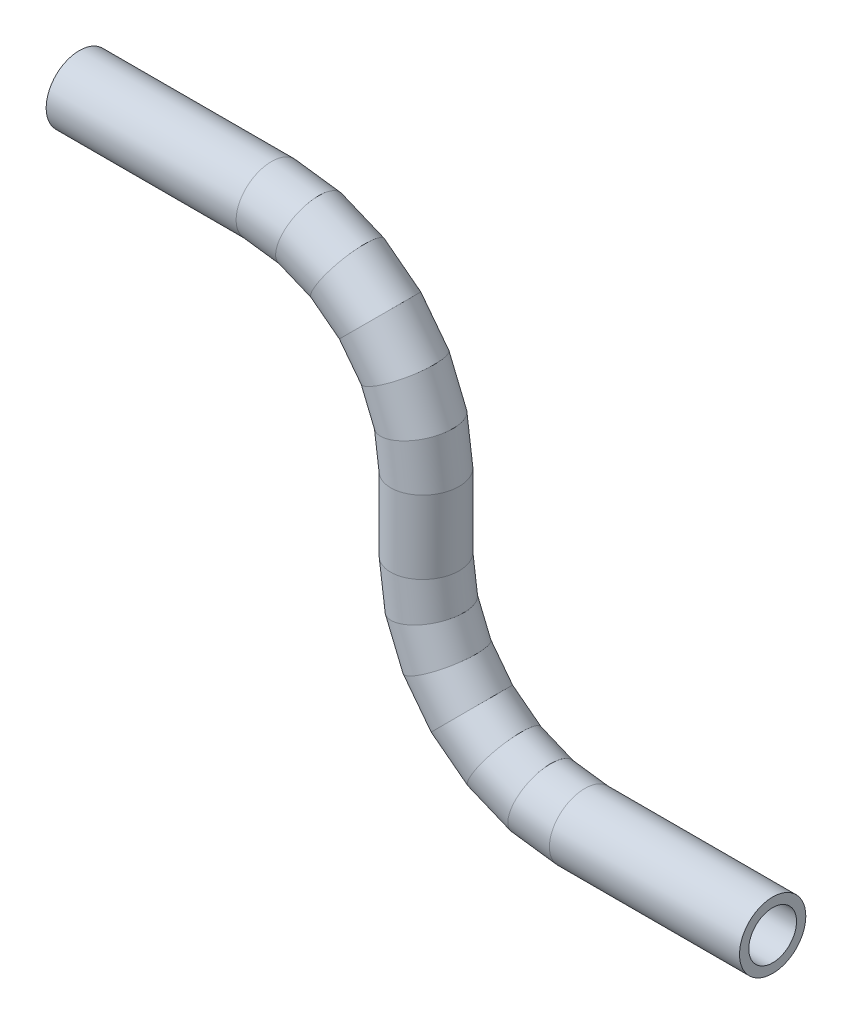
ISO-10303-21;
HEADER;
FILE_DESCRIPTION(('STEP AP214'),'2;1');
FILE_NAME('part.step','',(''),(''),'','','');
FILE_SCHEMA(('AUTOMOTIVE_DESIGN { 1 0 10303 214 1 1 1 1 }'));
ENDSEC;
DATA;
#1=APPLICATION_CONTEXT('core data for automotive mechanical design processes');
#2=APPLICATION_PROTOCOL_DEFINITION('international standard','automotive_design',2000,#1);
#3=PRODUCT_CONTEXT('',#1,'mechanical');
#4=PRODUCT('Part','Part','',(#3));
#5=PRODUCT_RELATED_PRODUCT_CATEGORY('part','',(#4));
#6=PRODUCT_DEFINITION_FORMATION('','',#4);
#7=PRODUCT_DEFINITION_CONTEXT('part definition',#1,'design');
#8=PRODUCT_DEFINITION('design','',#6,#7);
#9=PRODUCT_DEFINITION_SHAPE('','',#8);
#10=(LENGTH_UNIT() NAMED_UNIT(*) SI_UNIT(.MILLI.,.METRE.));
#11=(NAMED_UNIT(*) PLANE_ANGLE_UNIT() SI_UNIT($,.RADIAN.));
#12=(NAMED_UNIT(*) SI_UNIT($,.STERADIAN.) SOLID_ANGLE_UNIT());
#13=UNCERTAINTY_MEASURE_WITH_UNIT(LENGTH_MEASURE(1.E-05),#10,'distance_accuracy_value','');
#14=(GEOMETRIC_REPRESENTATION_CONTEXT(3) GLOBAL_UNCERTAINTY_ASSIGNED_CONTEXT((#13)) GLOBAL_UNIT_ASSIGNED_CONTEXT((#10,
#11,#12)) REPRESENTATION_CONTEXT('',''));
#15=CARTESIAN_POINT('',(0.,0.,0.));
#16=DIRECTION('',(0.,0.,1.));
#17=DIRECTION('',(1.,0.,0.));
#18=AXIS2_PLACEMENT_3D('',#15,#16,#17);
#19=CARTESIAN_POINT('',(-2802.53495729301,69.9999999999989,0.));
#20=DIRECTION('',(-1.,0.,0.));
#21=DIRECTION('',(0.,0.,1.));
#22=AXIS2_PLACEMENT_3D('',#19,#20,#21);
#23=CYLINDRICAL_SURFACE('',#22,3.175);
#24=CARTESIAN_POINT('',(-2803.09277838077,69.9999999999997,0.));
#25=DIRECTION('',(-0.997858923238604,0.0654031292301424,0.));
#26=DIRECTION('',(0.0654031292301424,0.997858923238604,0.));
#27=AXIS2_PLACEMENT_3D('',#24,#25,#26);
#28=ELLIPSE('',#27,3.18181250481318,3.175);
#29=CARTESIAN_POINT('',(-2802.88467788634,73.1749999999997,0.));
#30=VERTEX_POINT('',#29);
#31=EDGE_CURVE('E45',#30,#30,#28,.T.);
#32=ORIENTED_EDGE('',*,*,#31,.T.);
#33=EDGE_LOOP('',(#32));
#34=FACE_BOUND('',#33,.T.);
#35=CARTESIAN_POINT('',(-2821.29277838077,69.9999999999989,0.));
#36=DIRECTION('',(1.,0.,0.));
#37=DIRECTION('',(0.,0.,-1.));
#38=AXIS2_PLACEMENT_3D('',#35,#36,#37);
#39=CIRCLE('',#38,3.175);
#40=CARTESIAN_POINT('',(-2821.29277838077,69.9999999999989,-3.175));
#41=VERTEX_POINT('',#40);
#42=EDGE_CURVE('E98',#41,#41,#39,.T.);
#43=ORIENTED_EDGE('',*,*,#42,.T.);
#44=EDGE_LOOP('',(#43));
#45=FACE_BOUND('',#44,.T.);
#46=ADVANCED_FACE('F39',(#34,#45),#23,.T.);
#47=CARTESIAN_POINT('',(-2798.19962276544,69.3558038421575,0.));
#48=DIRECTION('',(-0.991444861373811,0.13052619222005,0.));
#49=DIRECTION('',(-0.13052619222005,-0.991444861373811,0.));
#50=AXIS2_PLACEMENT_3D('',#47,#48,#49);
#51=CYLINDRICAL_SURFACE('',#50,3.175);
#52=CARTESIAN_POINT('',(-2799.21049270424,69.4888873943359,0.));
#53=DIRECTION('',(-0.965925826289071,0.258819045102512,0.));
#54=DIRECTION('',(0.258819045102512,0.965925826289071,0.));
#55=AXIS2_PLACEMENT_3D('',#52,#53,#54);
#56=ELLIPSE('',#55,3.20239694984198,3.175);
#57=CARTESIAN_POINT('',(-2798.38165138364,72.5821653142176,0.));
#58=VERTEX_POINT('',#57);
#59=EDGE_CURVE('E137',#58,#58,#56,.T.);
#60=ORIENTED_EDGE('',*,*,#59,.T.);
#61=EDGE_LOOP('',(#60));
#62=FACE_BOUND('',#61,.T.);
#63=ORIENTED_EDGE('',*,*,#31,.F.);
#64=EDGE_LOOP('',(#63));
#65=FACE_BOUND('',#64,.T.);
#66=ADVANCED_FACE('F144',(#62,#65),#51,.T.);
#67=CARTESIAN_POINT('',(-2794.65079755777,67.6001998243816,0.));
#68=DIRECTION('',(-0.923879532511294,0.382683432365073,0.));
#69=DIRECTION('',(-0.382683432365073,-0.923879532511294,0.));
#70=AXIS2_PLACEMENT_3D('',#67,#68,#69);
#71=CYLINDRICAL_SURFACE('',#70,3.175);
#72=CARTESIAN_POINT('',(-2795.59277838077,67.9903810567662,0.));
#73=DIRECTION('',(-0.866025403784438,0.500000000000001,0.));
#74=DIRECTION('',(0.500000000000001,0.866025403784438,0.));
#75=AXIS2_PLACEMENT_3D('',#72,#73,#74);
#76=ELLIPSE('',#75,3.20239694984199,3.175);
#77=CARTESIAN_POINT('',(-2793.99157990585,70.7637381683312,0.));
#78=VERTEX_POINT('',#77);
#79=EDGE_CURVE('E131',#78,#78,#76,.T.);
#80=ORIENTED_EDGE('',*,*,#79,.T.);
#81=EDGE_LOOP('',(#80));
#82=FACE_BOUND('',#81,.T.);
#83=ORIENTED_EDGE('',*,*,#59,.F.);
#84=EDGE_LOOP('',(#83));
#85=FACE_BOUND('',#84,.T.);
#86=ADVANCED_FACE('F150',(#82,#85),#71,.T.);
#87=CARTESIAN_POINT('',(-2791.67727939215,64.9859130113881,0.));
#88=DIRECTION('',(-0.793353340291223,0.608761429008737,0.));
#89=DIRECTION('',(-0.608761429008737,-0.793353340291223,0.));
#90=AXIS2_PLACEMENT_3D('',#87,#88,#89);
#91=CYLINDRICAL_SURFACE('',#90,3.175);
#92=CARTESIAN_POINT('',(-2792.48617666298,65.6066017177979,0.));
#93=DIRECTION('',(-0.70710678118655,0.707106781186545,0.));
#94=DIRECTION('',(0.707106781186545,0.70710678118655,0.));
#95=AXIS2_PLACEMENT_3D('',#92,#93,#94);
#96=ELLIPSE('',#95,3.20239694984198,3.175);
#97=CARTESIAN_POINT('',(-2790.22174006369,67.8710383170822,0.));
#98=VERTEX_POINT('',#97);
#99=EDGE_CURVE('E132',#98,#98,#96,.T.);
#100=ORIENTED_EDGE('',*,*,#99,.T.);
#101=EDGE_LOOP('',(#100));
#102=FACE_BOUND('',#101,.T.);
#103=ORIENTED_EDGE('',*,*,#79,.F.);
#104=EDGE_LOOP('',(#103));
#105=FACE_BOUND('',#104,.T.);
#106=ADVANCED_FACE('F155',(#102,#105),#91,.T.);
#107=CARTESIAN_POINT('',(-2789.4817086176,61.6911027291707,0.));
#108=DIRECTION('',(-0.608761429008741,0.793353340291219,0.));
#109=DIRECTION('',(-0.793353340291219,-0.608761429008741,0.));
#110=AXIS2_PLACEMENT_3D('',#107,#108,#109);
#111=CYLINDRICAL_SURFACE('',#110,3.175);
#112=CARTESIAN_POINT('',(-2790.10239732401,62.4999999999998,0.));
#113=DIRECTION('',(-0.50000000000001,0.866025403784433,0.));
#114=DIRECTION('',(0.866025403784433,0.50000000000001,0.));
#115=AXIS2_PLACEMENT_3D('',#112,#113,#114);
#116=ELLIPSE('',#115,3.20239694984199,3.175);
#117=CARTESIAN_POINT('',(-2787.32904021244,64.1011984749209,0.));
#118=VERTEX_POINT('',#117);
#119=EDGE_CURVE('E126',#118,#118,#116,.T.);
#120=ORIENTED_EDGE('',*,*,#119,.T.);
#121=EDGE_LOOP('',(#120));
#122=FACE_BOUND('',#121,.T.);
#123=ORIENTED_EDGE('',*,*,#99,.F.);
#124=EDGE_LOOP('',(#123));
#125=FACE_BOUND('',#124,.T.);
#126=ADVANCED_FACE('F266',(#122,#125),#111,.T.);
#127=CARTESIAN_POINT('',(-2788.21370975405,57.9403048535307,0.));
#128=DIRECTION('',(-0.382683432365086,0.923879532511288,0.));
#129=DIRECTION('',(-0.923879532511289,-0.382683432365086,0.));
#130=AXIS2_PLACEMENT_3D('',#127,#128,#129);
#131=CYLINDRICAL_SURFACE('',#130,3.175);
#132=CARTESIAN_POINT('',(-2788.60389098644,58.8822856765378,0.));
#133=DIRECTION('',(-0.258819045102501,0.965925826289073,0.));
#134=DIRECTION('',(0.965925826289074,0.258819045102501,0.));
#135=AXIS2_PLACEMENT_3D('',#132,#133,#134);
#136=ELLIPSE('',#135,3.20239694984199,3.175);
#137=CARTESIAN_POINT('',(-2785.51061306656,59.7111269971351,0.));
#138=VERTEX_POINT('',#137);
#139=EDGE_CURVE('E123',#138,#138,#136,.T.);
#140=ORIENTED_EDGE('',*,*,#139,.T.);
#141=EDGE_LOOP('',(#140));
#142=FACE_BOUND('',#141,.T.);
#143=ORIENTED_EDGE('',*,*,#119,.F.);
#144=EDGE_LOOP('',(#143));
#145=FACE_BOUND('',#144,.T.);
#146=ADVANCED_FACE('F265',(#142,#145),#131,.T.);
#147=CARTESIAN_POINT('',(-2788.01996811825,54.4469511489702,0.));
#148=DIRECTION('',(-0.130526192220016,0.991444861373815,0.));
#149=DIRECTION('',(-0.991444861373815,-0.130526192220016,0.));
#150=AXIS2_PLACEMENT_3D('',#147,#148,#149);
#151=CYLINDRICAL_SURFACE('',#150,3.175);
#152=CARTESIAN_POINT('',(-2788.09277838078,55.,0.));
#153=DIRECTION('',(-0.065403129230125,0.997858923238605,0.));
#154=DIRECTION('',(0.997858923238605,0.065403129230125,0.));
#155=AXIS2_PLACEMENT_3D('',#152,#153,#154);
#156=ELLIPSE('',#155,3.18181250481317,3.175);
#157=CARTESIAN_POINT('',(-2784.91777838077,55.2081004944383,0.));
#158=VERTEX_POINT('',#157);
#159=EDGE_CURVE('E124',#158,#158,#156,.T.);
#160=ORIENTED_EDGE('',*,*,#159,.T.);
#161=EDGE_LOOP('',(#160));
#162=FACE_BOUND('',#161,.T.);
#163=ORIENTED_EDGE('',*,*,#139,.F.);
#164=EDGE_LOOP('',(#163));
#165=FACE_BOUND('',#164,.T.);
#166=ADVANCED_FACE('F256',(#162,#165),#151,.T.);
#167=CARTESIAN_POINT('',(-2788.09277838078,47.442178912235,0.));
#168=DIRECTION('',(0.,1.,0.));
#169=DIRECTION('',(0.,0.,1.));
#170=AXIS2_PLACEMENT_3D('',#167,#168,#169);
#171=CYLINDRICAL_SURFACE('',#170,3.175);
#172=CARTESIAN_POINT('',(-2788.09277838078,48.,0.));
#173=DIRECTION('',(-0.0654031292301811,0.997858923238601,0.));
#174=DIRECTION('',(-0.997858923238601,-0.0654031292301811,0.));
#175=AXIS2_PLACEMENT_3D('',#172,#173,#174);
#176=ELLIPSE('',#175,3.18181250481318,3.175);
#177=CARTESIAN_POINT('',(-2791.26777838078,47.7918995055615,0.));
#178=VERTEX_POINT('',#177);
#179=EDGE_CURVE('E116',#178,#178,#176,.T.);
#180=ORIENTED_EDGE('',*,*,#179,.T.);
#181=EDGE_LOOP('',(#180));
#182=FACE_BOUND('',#181,.T.);
#183=ORIENTED_EDGE('',*,*,#159,.F.);
#184=EDGE_LOOP('',(#183));
#185=FACE_BOUND('',#184,.T.);
#186=ADVANCED_FACE('F255',(#182,#185),#171,.T.);
#187=CARTESIAN_POINT('',(-2787.44858222293,43.1068443846687,0.));
#188=DIRECTION('',(-0.130526192220127,0.991444861373801,0.));
#189=DIRECTION('',(-0.991444861373801,-0.130526192220127,0.));
#190=AXIS2_PLACEMENT_3D('',#187,#188,#189);
#191=CYLINDRICAL_SURFACE('',#190,3.175);
#192=CARTESIAN_POINT('',(-2787.58166577511,44.1177143234621,0.));
#193=DIRECTION('',(-0.258819045102505,0.965925826289073,0.));
#194=DIRECTION('',(-0.965925826289073,-0.258819045102505,0.));
#195=AXIS2_PLACEMENT_3D('',#192,#193,#194);
#196=ELLIPSE('',#195,3.20239694984195,3.175);
#197=CARTESIAN_POINT('',(-2790.67494369499,43.2888730028648,0.));
#198=VERTEX_POINT('',#197);
#199=EDGE_CURVE('E117',#198,#198,#196,.T.);
#200=ORIENTED_EDGE('',*,*,#199,.T.);
#201=EDGE_LOOP('',(#200));
#202=FACE_BOUND('',#201,.T.);
#203=ORIENTED_EDGE('',*,*,#179,.F.);
#204=EDGE_LOOP('',(#203));
#205=FACE_BOUND('',#204,.T.);
#206=ADVANCED_FACE('F248',(#202,#205),#191,.T.);
#207=CARTESIAN_POINT('',(-2785.69297820516,39.5580191769915,0.));
#208=DIRECTION('',(-0.382683432364989,0.923879532511328,0.));
#209=DIRECTION('',(-0.923879532511329,-0.382683432364989,0.));
#210=AXIS2_PLACEMENT_3D('',#207,#208,#209);
#211=CYLINDRICAL_SURFACE('',#210,3.175);
#212=CARTESIAN_POINT('',(-2786.08315943754,40.4999999999999,0.));
#213=DIRECTION('',(-0.499999999999964,0.866025403784459,0.));
#214=DIRECTION('',(-0.86602540378446,-0.499999999999964,0.));
#215=AXIS2_PLACEMENT_3D('',#212,#213,#214);
#216=ELLIPSE('',#215,3.20239694984201,3.175);
#217=CARTESIAN_POINT('',(-2788.85651654911,38.898801525079,0.));
#218=VERTEX_POINT('',#217);
#219=EDGE_CURVE('E114',#218,#218,#216,.T.);
#220=ORIENTED_EDGE('',*,*,#219,.T.);
#221=EDGE_LOOP('',(#220));
#222=FACE_BOUND('',#221,.T.);
#223=ORIENTED_EDGE('',*,*,#199,.F.);
#224=EDGE_LOOP('',(#223));
#225=FACE_BOUND('',#224,.T.);
#226=ADVANCED_FACE('F247',(#222,#225),#211,.T.);
#227=CARTESIAN_POINT('',(-2783.07869139216,36.5845010113728,0.));
#228=DIRECTION('',(-0.608761429008741,0.79335334029122,0.));
#229=DIRECTION('',(-0.79335334029122,-0.608761429008741,0.));
#230=AXIS2_PLACEMENT_3D('',#227,#228,#229);
#231=CYLINDRICAL_SURFACE('',#230,3.175);
#232=CARTESIAN_POINT('',(-2783.69938009857,37.3933982822015,0.));
#233=DIRECTION('',(-0.70710678118655,0.707106781186545,0.));
#234=DIRECTION('',(-0.707106781186545,-0.70710678118655,0.));
#235=AXIS2_PLACEMENT_3D('',#232,#233,#234);
#236=ELLIPSE('',#235,3.20239694984198,3.175);
#237=CARTESIAN_POINT('',(-2785.96381669786,35.1289616829172,0.));
#238=VERTEX_POINT('',#237);
#239=EDGE_CURVE('E109',#238,#238,#236,.T.);
#240=ORIENTED_EDGE('',*,*,#239,.T.);
#241=EDGE_LOOP('',(#240));
#242=FACE_BOUND('',#241,.T.);
#243=ORIENTED_EDGE('',*,*,#219,.F.);
#244=EDGE_LOOP('',(#243));
#245=FACE_BOUND('',#244,.T.);
#246=ADVANCED_FACE('F245',(#242,#245),#231,.T.);
#247=CARTESIAN_POINT('',(-2779.78388110995,34.3889302368234,0.));
#248=DIRECTION('',(-0.793353340291224,0.608761429008736,0.));
#249=DIRECTION('',(-0.608761429008736,-0.793353340291224,0.));
#250=AXIS2_PLACEMENT_3D('',#247,#248,#249);
#251=CYLINDRICAL_SURFACE('',#250,3.175);
#252=CARTESIAN_POINT('',(-2780.59277838077,35.0096189432338,0.));
#253=DIRECTION('',(-0.866025403784438,0.500000000000001,0.));
#254=DIRECTION('',(-0.500000000000001,-0.866025403784438,0.));
#255=AXIS2_PLACEMENT_3D('',#252,#253,#254);
#256=ELLIPSE('',#255,3.20239694984199,3.175);
#257=CARTESIAN_POINT('',(-2782.1939768557,32.2362618316688,0.));
#258=VERTEX_POINT('',#257);
#259=EDGE_CURVE('E110',#258,#258,#256,.T.);
#260=ORIENTED_EDGE('',*,*,#259,.T.);
#261=EDGE_LOOP('',(#260));
#262=FACE_BOUND('',#261,.T.);
#263=ORIENTED_EDGE('',*,*,#239,.F.);
#264=EDGE_LOOP('',(#263));
#265=FACE_BOUND('',#264,.T.);
#266=ADVANCED_FACE('F236',(#262,#265),#251,.T.);
#267=CARTESIAN_POINT('',(-2776.03308323431,33.1209313732794,0.));
#268=DIRECTION('',(-0.923879532511293,0.382683432365075,0.));
#269=DIRECTION('',(-0.382683432365075,-0.923879532511293,0.));
#270=AXIS2_PLACEMENT_3D('',#267,#268,#269);
#271=CYLINDRICAL_SURFACE('',#270,3.175);
#272=CARTESIAN_POINT('',(-2776.97506405731,33.5111126056641,0.));
#273=DIRECTION('',(-0.965925826289071,0.258819045102511,0.));
#274=DIRECTION('',(-0.258819045102511,-0.965925826289071,0.));
#275=AXIS2_PLACEMENT_3D('',#272,#273,#274);
#276=ELLIPSE('',#275,3.20239694984198,3.175);
#277=CARTESIAN_POINT('',(-2777.80390537791,30.4178346857823,0.));
#278=VERTEX_POINT('',#277);
#279=EDGE_CURVE('E102',#278,#278,#276,.T.);
#280=ORIENTED_EDGE('',*,*,#279,.T.);
#281=EDGE_LOOP('',(#280));
#282=FACE_BOUND('',#281,.T.);
#283=ORIENTED_EDGE('',*,*,#259,.F.);
#284=EDGE_LOOP('',(#283));
#285=FACE_BOUND('',#284,.T.);
#286=ADVANCED_FACE('F231',(#282,#285),#271,.T.);
#287=CARTESIAN_POINT('',(-2772.53972952974,32.9271897374741,0.));
#288=DIRECTION('',(-0.991444861373811,0.130526192220047,0.));
#289=DIRECTION('',(-0.130526192220047,-0.991444861373811,0.));
#290=AXIS2_PLACEMENT_3D('',#287,#288,#289);
#291=CYLINDRICAL_SURFACE('',#290,3.175);
#292=CARTESIAN_POINT('',(-2773.09277838077,33.,0.));
#293=DIRECTION('',(-0.997858923238604,0.0654031292301407,0.));
#294=DIRECTION('',(-0.0654031292301407,-0.997858923238604,0.));
#295=AXIS2_PLACEMENT_3D('',#292,#293,#294);
#296=ELLIPSE('',#295,3.18181250481318,3.175);
#297=CARTESIAN_POINT('',(-2773.30087887521,29.825,0.));
#298=VERTEX_POINT('',#297);
#299=EDGE_CURVE('E101',#298,#298,#296,.T.);
#300=ORIENTED_EDGE('',*,*,#299,.T.);
#301=EDGE_LOOP('',(#300));
#302=FACE_BOUND('',#301,.T.);
#303=ORIENTED_EDGE('',*,*,#279,.F.);
#304=EDGE_LOOP('',(#303));
#305=FACE_BOUND('',#304,.T.);
#306=ADVANCED_FACE('F228',(#302,#305),#291,.T.);
#307=CARTESIAN_POINT('',(-2754.89277838077,33.,0.));
#308=DIRECTION('',(-1.,0.,0.));
#309=DIRECTION('',(0.,0.,1.));
#310=AXIS2_PLACEMENT_3D('',#307,#308,#309);
#311=CYLINDRICAL_SURFACE('',#310,3.175);
#312=CARTESIAN_POINT('',(-2754.89277838077,33.,0.));
#313=DIRECTION('',(1.,0.,0.));
#314=DIRECTION('',(0.,0.,-1.));
#315=AXIS2_PLACEMENT_3D('',#312,#313,#314);
#316=CIRCLE('',#315,3.175);
#317=CARTESIAN_POINT('',(-2754.89277838077,33.,-3.175));
#318=VERTEX_POINT('',#317);
#319=EDGE_CURVE('E92',#318,#318,#316,.T.);
#320=ORIENTED_EDGE('',*,*,#319,.F.);
#321=EDGE_LOOP('',(#320));
#322=FACE_BOUND('',#321,.T.);
#323=ORIENTED_EDGE('',*,*,#299,.F.);
#324=EDGE_LOOP('',(#323));
#325=FACE_BOUND('',#324,.T.);
#326=ADVANCED_FACE('F227',(#322,#325),#311,.T.);
#327=CARTESIAN_POINT('',(-2821.29277838077,69.9999999999989,0.));
#328=DIRECTION('',(1.,0.,0.));
#329=DIRECTION('',(0.,0.,-1.));
#330=AXIS2_PLACEMENT_3D('',#327,#328,#329);
#331=PLANE('',#330);
#332=CARTESIAN_POINT('',(-2821.29277838077,69.9999999999989,0.));
#333=DIRECTION('',(1.,0.,0.));
#334=DIRECTION('',(0.,0.,-1.));
#335=AXIS2_PLACEMENT_3D('',#332,#333,#334);
#336=CIRCLE('',#335,2.286);
#337=CARTESIAN_POINT('',(-2821.29277838077,69.9999999999989,-2.286));
#338=VERTEX_POINT('',#337);
#339=EDGE_CURVE('E95',#338,#338,#336,.F.);
#340=ORIENTED_EDGE('',*,*,#339,.F.);
#341=EDGE_LOOP('',(#340));
#342=FACE_BOUND('',#341,.T.);
#343=ORIENTED_EDGE('',*,*,#42,.F.);
#344=EDGE_LOOP('',(#343));
#345=FACE_BOUND('',#344,.T.);
#346=ADVANCED_FACE('F225',(#342,#345),#331,.F.);
#347=CARTESIAN_POINT('',(-2754.89277838077,33.,0.));
#348=DIRECTION('',(1.,0.,0.));
#349=DIRECTION('',(0.,0.,-1.));
#350=AXIS2_PLACEMENT_3D('',#347,#348,#349);
#351=PLANE('',#350);
#352=CARTESIAN_POINT('',(-2754.89277838077,33.,0.));
#353=DIRECTION('',(1.,0.,0.));
#354=DIRECTION('',(0.,0.,-1.));
#355=AXIS2_PLACEMENT_3D('',#352,#353,#354);
#356=CIRCLE('',#355,2.286);
#357=CARTESIAN_POINT('',(-2754.89277838077,33.,-2.286));
#358=VERTEX_POINT('',#357);
#359=EDGE_CURVE('E46',#358,#358,#356,.F.);
#360=ORIENTED_EDGE('',*,*,#359,.T.);
#361=EDGE_LOOP('',(#360));
#362=FACE_BOUND('',#361,.T.);
#363=ORIENTED_EDGE('',*,*,#319,.T.);
#364=EDGE_LOOP('',(#363));
#365=FACE_BOUND('',#364,.T.);
#366=ADVANCED_FACE('F217',(#362,#365),#351,.T.);
#367=CARTESIAN_POINT('',(-2802.66314719758,69.9999999999989,0.));
#368=DIRECTION('',(-1.,0.,0.));
#369=DIRECTION('',(0.,0.,1.));
#370=AXIS2_PLACEMENT_3D('',#367,#368,#369);
#371=CYLINDRICAL_SURFACE('',#370,2.286);
#372=CARTESIAN_POINT('',(-2803.09277838077,69.9999999999998,0.));
#373=DIRECTION('',(-0.997858923238604,0.0654031292301425,0.));
#374=DIRECTION('',(0.0654031292301425,0.997858923238604,0.));
#375=AXIS2_PLACEMENT_3D('',#372,#373,#374);
#376=ELLIPSE('',#375,2.29090500346549,2.286);
#377=CARTESIAN_POINT('',(-2802.94294602478,72.2859999999998,0.));
#378=VERTEX_POINT('',#377);
#379=EDGE_CURVE('E90',#378,#378,#376,.F.);
#380=ORIENTED_EDGE('',*,*,#379,.T.);
#381=EDGE_LOOP('',(#380));
#382=FACE_BOUND('',#381,.T.);
#383=ORIENTED_EDGE('',*,*,#339,.T.);
#384=EDGE_LOOP('',(#383));
#385=FACE_BOUND('',#384,.T.);
#386=ADVANCED_FACE('F212',(#382,#385),#371,.F.);
#387=CARTESIAN_POINT('',(-2798.45490589219,69.3894125033853,0.));
#388=DIRECTION('',(-0.99144486137381,0.13052619222005,0.));
#389=DIRECTION('',(-0.13052619222005,-0.991444861373811,0.));
#390=AXIS2_PLACEMENT_3D('',#387,#388,#389);
#391=CYLINDRICAL_SURFACE('',#390,2.286);
#392=CARTESIAN_POINT('',(-2799.21049270424,69.4888873943357,0.));
#393=DIRECTION('',(-0.965925826289071,0.258819045102512,0.));
#394=DIRECTION('',(0.258819045102512,0.965925826289071,0.));
#395=AXIS2_PLACEMENT_3D('',#392,#393,#394);
#396=ELLIPSE('',#395,2.30572580388623,2.286);
#397=CARTESIAN_POINT('',(-2798.61372695341,71.7160474966505,0.));
#398=VERTEX_POINT('',#397);
#399=EDGE_CURVE('E88',#398,#398,#396,.F.);
#400=ORIENTED_EDGE('',*,*,#399,.T.);
#401=EDGE_LOOP('',(#400));
#402=FACE_BOUND('',#401,.T.);
#403=ORIENTED_EDGE('',*,*,#379,.F.);
#404=EDGE_LOOP('',(#403));
#405=FACE_BOUND('',#404,.T.);
#406=ADVANCED_FACE('F209',(#402,#405),#391,.F.);
#407=CARTESIAN_POINT('',(-2794.8886835613,67.6987354333429,0.));
#408=DIRECTION('',(-0.923879532511294,0.382683432365073,0.));
#409=DIRECTION('',(-0.382683432365073,-0.923879532511294,0.));
#410=AXIS2_PLACEMENT_3D('',#407,#408,#409);
#411=CYLINDRICAL_SURFACE('',#410,2.286);
#412=CARTESIAN_POINT('',(-2795.59277838077,67.9903810567662,0.));
#413=DIRECTION('',(-0.866025403784438,0.500000000000001,0.));
#414=DIRECTION('',(0.500000000000001,0.866025403784438,0.));
#415=AXIS2_PLACEMENT_3D('',#412,#413,#414);
#416=ELLIPSE('',#415,2.30572580388623,2.286);
#417=CARTESIAN_POINT('',(-2794.43991547883,69.987198177093,0.));
#418=VERTEX_POINT('',#417);
#419=EDGE_CURVE('E85',#418,#418,#416,.F.);
#420=ORIENTED_EDGE('',*,*,#419,.T.);
#421=EDGE_LOOP('',(#420));
#422=FACE_BOUND('',#421,.T.);
#423=ORIENTED_EDGE('',*,*,#399,.F.);
#424=EDGE_LOOP('',(#423));
#425=FACE_BOUND('',#424,.T.);
#426=ADVANCED_FACE('F206',(#422,#425),#411,.F.);
#427=CARTESIAN_POINT('',(-2791.88155673445,65.1426605291705,0.));
#428=DIRECTION('',(-0.793353340291223,0.608761429008737,0.));
#429=DIRECTION('',(-0.608761429008737,-0.793353340291223,0.));
#430=AXIS2_PLACEMENT_3D('',#427,#428,#429);
#431=CYLINDRICAL_SURFACE('',#430,2.286);
#432=CARTESIAN_POINT('',(-2792.48617666298,65.6066017177979,0.));
#433=DIRECTION('',(-0.707106781186549,0.707106781186546,0.));
#434=DIRECTION('',(0.707106781186546,0.707106781186549,0.));
#435=AXIS2_PLACEMENT_3D('',#432,#433,#434);
#436=ELLIPSE('',#435,2.30572580388622,2.286);
#437=CARTESIAN_POINT('',(-2790.85578231149,67.2369960692826,0.));
#438=VERTEX_POINT('',#437);
#439=EDGE_CURVE('E78',#438,#438,#436,.F.);
#440=ORIENTED_EDGE('',*,*,#439,.T.);
#441=EDGE_LOOP('',(#440));
#442=FACE_BOUND('',#441,.T.);
#443=ORIENTED_EDGE('',*,*,#419,.F.);
#444=EDGE_LOOP('',(#443));
#445=FACE_BOUND('',#444,.T.);
#446=ADVANCED_FACE('F205',(#442,#445),#431,.F.);
#447=CARTESIAN_POINT('',(-2789.63845613538,61.8953800714745,0.));
#448=DIRECTION('',(-0.608761429008742,0.793353340291219,0.));
#449=DIRECTION('',(-0.793353340291219,-0.608761429008742,0.));
#450=AXIS2_PLACEMENT_3D('',#447,#448,#449);
#451=CYLINDRICAL_SURFACE('',#450,2.286);
#452=CARTESIAN_POINT('',(-2790.10239732401,62.4999999999998,0.));
#453=DIRECTION('',(-0.50000000000001,0.866025403784433,0.));
#454=DIRECTION('',(0.866025403784433,0.50000000000001,0.));
#455=AXIS2_PLACEMENT_3D('',#452,#453,#454);
#456=ELLIPSE('',#455,2.30572580388623,2.286);
#457=CARTESIAN_POINT('',(-2788.10558020368,63.652862901943,0.));
#458=VERTEX_POINT('',#457);
#459=EDGE_CURVE('E80',#458,#458,#456,.F.);
#460=ORIENTED_EDGE('',*,*,#459,.T.);
#461=EDGE_LOOP('',(#460));
#462=FACE_BOUND('',#461,.T.);
#463=ORIENTED_EDGE('',*,*,#439,.F.);
#464=EDGE_LOOP('',(#463));
#465=FACE_BOUND('',#464,.T.);
#466=ADVANCED_FACE('F196',(#462,#465),#451,.F.);
#467=CARTESIAN_POINT('',(-2788.31224536302,58.1781908570624,0.));
#468=DIRECTION('',(-0.382683432365086,0.923879532511288,0.));
#469=DIRECTION('',(-0.923879532511288,-0.382683432365086,0.));
#470=AXIS2_PLACEMENT_3D('',#467,#468,#469);
#471=CYLINDRICAL_SURFACE('',#470,2.286);
#472=CARTESIAN_POINT('',(-2788.60389098644,58.8822856765378,0.));
#473=DIRECTION('',(-0.258819045102501,0.965925826289073,0.));
#474=DIRECTION('',(0.965925826289074,0.258819045102501,0.));
#475=AXIS2_PLACEMENT_3D('',#472,#473,#474);
#476=ELLIPSE('',#475,2.30572580388623,2.286);
#477=CARTESIAN_POINT('',(-2786.37673088412,59.4790514273679,0.));
#478=VERTEX_POINT('',#477);
#479=EDGE_CURVE('E74',#478,#478,#476,.F.);
#480=ORIENTED_EDGE('',*,*,#479,.T.);
#481=EDGE_LOOP('',(#480));
#482=FACE_BOUND('',#481,.T.);
#483=ORIENTED_EDGE('',*,*,#459,.F.);
#484=EDGE_LOOP('',(#483));
#485=FACE_BOUND('',#484,.T.);
#486=ADVANCED_FACE('F191',(#482,#485),#471,.F.);
#487=CARTESIAN_POINT('',(-2788.03670025837,54.5740443711402,0.));
#488=DIRECTION('',(-0.130526192220016,0.991444861373815,0.));
#489=DIRECTION('',(-0.991444861373815,-0.130526192220016,0.));
#490=AXIS2_PLACEMENT_3D('',#487,#488,#489);
#491=CYLINDRICAL_SURFACE('',#490,2.286);
#492=CARTESIAN_POINT('',(-2788.09277838078,55.,0.));
#493=DIRECTION('',(-0.065403129230125,0.997858923238605,0.));
#494=DIRECTION('',(0.997858923238605,0.065403129230125,0.));
#495=AXIS2_PLACEMENT_3D('',#492,#493,#494);
#496=ELLIPSE('',#495,2.29090500346548,2.286);
#497=CARTESIAN_POINT('',(-2785.80677838078,55.1498323559956,0.));
#498=VERTEX_POINT('',#497);
#499=EDGE_CURVE('E72',#498,#498,#496,.F.);
#500=ORIENTED_EDGE('',*,*,#499,.T.);
#501=EDGE_LOOP('',(#500));
#502=FACE_BOUND('',#501,.T.);
#503=ORIENTED_EDGE('',*,*,#479,.F.);
#504=EDGE_LOOP('',(#503));
#505=FACE_BOUND('',#504,.T.);
#506=ADVANCED_FACE('F188',(#502,#505),#491,.F.);
#507=CARTESIAN_POINT('',(-2788.09277838078,47.5703688168094,0.));
#508=DIRECTION('',(0.,1.,0.));
#509=DIRECTION('',(0.,0.,1.));
#510=AXIS2_PLACEMENT_3D('',#507,#508,#509);
#511=CYLINDRICAL_SURFACE('',#510,2.286);
#512=CARTESIAN_POINT('',(-2788.09277838078,48.,0.));
#513=DIRECTION('',(-0.0654031292301811,0.997858923238601,0.));
#514=DIRECTION('',(-0.997858923238601,-0.0654031292301811,0.));
#515=AXIS2_PLACEMENT_3D('',#512,#513,#514);
#516=ELLIPSE('',#515,2.29090500346549,2.286);
#517=CARTESIAN_POINT('',(-2790.37877838077,47.8501676440043,0.));
#518=VERTEX_POINT('',#517);
#519=EDGE_CURVE('E70',#518,#518,#516,.F.);
#520=ORIENTED_EDGE('',*,*,#519,.T.);
#521=EDGE_LOOP('',(#520));
#522=FACE_BOUND('',#521,.T.);
#523=ORIENTED_EDGE('',*,*,#499,.F.);
#524=EDGE_LOOP('',(#523));
#525=FACE_BOUND('',#524,.T.);
#526=ADVANCED_FACE('F187',(#522,#525),#511,.F.);
#527=CARTESIAN_POINT('',(-2787.48219088416,43.3621275114122,0.));
#528=DIRECTION('',(-0.130526192220127,0.9914448613738,0.));
#529=DIRECTION('',(-0.991444861373801,-0.130526192220127,0.));
#530=AXIS2_PLACEMENT_3D('',#527,#528,#529);
#531=CYLINDRICAL_SURFACE('',#530,2.286);
#532=CARTESIAN_POINT('',(-2787.58166577511,44.117714323462,0.));
#533=DIRECTION('',(-0.258819045102505,0.965925826289073,0.));
#534=DIRECTION('',(-0.965925826289073,-0.258819045102505,0.));
#535=AXIS2_PLACEMENT_3D('',#532,#533,#534);
#536=ELLIPSE('',#535,2.3057258038862,2.286);
#537=CARTESIAN_POINT('',(-2789.80882587743,43.520948572632,0.));
#538=VERTEX_POINT('',#537);
#539=EDGE_CURVE('E63',#538,#538,#536,.F.);
#540=ORIENTED_EDGE('',*,*,#539,.T.);
#541=EDGE_LOOP('',(#540));
#542=FACE_BOUND('',#541,.T.);
#543=ORIENTED_EDGE('',*,*,#519,.F.);
#544=EDGE_LOOP('',(#543));
#545=FACE_BOUND('',#544,.T.);
#546=ADVANCED_FACE('F185',(#542,#545),#531,.F.);
#547=CARTESIAN_POINT('',(-2785.79151381412,39.7959051805237,0.));
#548=DIRECTION('',(-0.382683432364989,0.923879532511328,0.));
#549=DIRECTION('',(-0.923879532511329,-0.382683432364989,0.));
#550=AXIS2_PLACEMENT_3D('',#547,#548,#549);
#551=CYLINDRICAL_SURFACE('',#550,2.286);
#552=CARTESIAN_POINT('',(-2786.08315943754,40.4999999999999,0.));
#553=DIRECTION('',(-0.499999999999964,0.866025403784459,0.));
#554=DIRECTION('',(-0.866025403784459,-0.499999999999964,0.));
#555=AXIS2_PLACEMENT_3D('',#552,#553,#554);
#556=ELLIPSE('',#555,2.30572580388625,2.286);
#557=CARTESIAN_POINT('',(-2788.07997655787,39.3471370980568,0.));
#558=VERTEX_POINT('',#557);
#559=EDGE_CURVE('E65',#558,#558,#556,.F.);
#560=ORIENTED_EDGE('',*,*,#559,.T.);
#561=EDGE_LOOP('',(#560));
#562=FACE_BOUND('',#561,.T.);
#563=ORIENTED_EDGE('',*,*,#539,.F.);
#564=EDGE_LOOP('',(#563));
#565=FACE_BOUND('',#564,.T.);
#566=ADVANCED_FACE('F180',(#562,#565),#551,.F.);
#567=CARTESIAN_POINT('',(-2783.23543890995,36.7887783536767,0.));
#568=DIRECTION('',(-0.608761429008741,0.79335334029122,0.));
#569=DIRECTION('',(-0.79335334029122,-0.608761429008741,0.));
#570=AXIS2_PLACEMENT_3D('',#567,#568,#569);
#571=CYLINDRICAL_SURFACE('',#570,2.286);
#572=CARTESIAN_POINT('',(-2783.69938009857,37.3933982822017,0.));
#573=DIRECTION('',(-0.70710678118655,0.707106781186545,0.));
#574=DIRECTION('',(-0.707106781186545,-0.70710678118655,0.));
#575=AXIS2_PLACEMENT_3D('',#572,#573,#574);
#576=ELLIPSE('',#575,2.30572580388622,2.286);
#577=CARTESIAN_POINT('',(-2785.32977445006,35.7630039307169,0.));
#578=VERTEX_POINT('',#577);
#579=EDGE_CURVE('E56',#578,#578,#576,.F.);
#580=ORIENTED_EDGE('',*,*,#579,.T.);
#581=EDGE_LOOP('',(#580));
#582=FACE_BOUND('',#581,.T.);
#583=ORIENTED_EDGE('',*,*,#559,.F.);
#584=EDGE_LOOP('',(#583));
#585=FACE_BOUND('',#584,.T.);
#586=ADVANCED_FACE('F171',(#582,#585),#571,.F.);
#587=CARTESIAN_POINT('',(-2779.98815845225,34.545677754606,0.));
#588=DIRECTION('',(-0.793353340291224,0.608761429008736,0.));
#589=DIRECTION('',(-0.608761429008736,-0.793353340291224,0.));
#590=AXIS2_PLACEMENT_3D('',#587,#588,#589);
#591=CYLINDRICAL_SURFACE('',#590,2.286);
#592=CARTESIAN_POINT('',(-2780.59277838077,35.0096189432338,0.));
#593=DIRECTION('',(-0.866025403784438,0.500000000000001,0.));
#594=DIRECTION('',(-0.500000000000001,-0.866025403784438,0.));
#595=AXIS2_PLACEMENT_3D('',#592,#593,#594);
#596=ELLIPSE('',#595,2.30572580388623,2.286);
#597=CARTESIAN_POINT('',(-2781.74564128272,33.012801822907,0.));
#598=VERTEX_POINT('',#597);
#599=EDGE_CURVE('E57',#598,#598,#596,.F.);
#600=ORIENTED_EDGE('',*,*,#599,.T.);
#601=EDGE_LOOP('',(#600));
#602=FACE_BOUND('',#601,.T.);
#603=ORIENTED_EDGE('',*,*,#579,.F.);
#604=EDGE_LOOP('',(#603));
#605=FACE_BOUND('',#604,.T.);
#606=ADVANCED_FACE('F168',(#602,#605),#591,.F.);
#607=CARTESIAN_POINT('',(-2776.27096923784,33.219466982241,0.));
#608=DIRECTION('',(-0.923879532511293,0.382683432365075,0.));
#609=DIRECTION('',(-0.382683432365075,-0.923879532511293,0.));
#610=AXIS2_PLACEMENT_3D('',#607,#608,#609);
#611=CYLINDRICAL_SURFACE('',#610,2.286);
#612=CARTESIAN_POINT('',(-2776.97506405731,33.511112605664,0.));
#613=DIRECTION('',(-0.965925826289071,0.258819045102511,0.));
#614=DIRECTION('',(-0.258819045102511,-0.965925826289071,0.));
#615=AXIS2_PLACEMENT_3D('',#612,#613,#614);
#616=ELLIPSE('',#615,2.30572580388623,2.286);
#617=CARTESIAN_POINT('',(-2777.57182980814,31.2839525033492,0.));
#618=VERTEX_POINT('',#617);
#619=EDGE_CURVE('E51',#618,#618,#616,.F.);
#620=ORIENTED_EDGE('',*,*,#619,.T.);
#621=EDGE_LOOP('',(#620));
#622=FACE_BOUND('',#621,.T.);
#623=ORIENTED_EDGE('',*,*,#599,.F.);
#624=EDGE_LOOP('',(#623));
#625=FACE_BOUND('',#624,.T.);
#626=ADVANCED_FACE('F162',(#622,#625),#611,.F.);
#627=CARTESIAN_POINT('',(-2772.66682275191,32.9439218775992,0.));
#628=DIRECTION('',(-0.991444861373811,0.130526192220047,0.));
#629=DIRECTION('',(-0.130526192220047,-0.991444861373811,0.));
#630=AXIS2_PLACEMENT_3D('',#627,#628,#629);
#631=CYLINDRICAL_SURFACE('',#630,2.286);
#632=CARTESIAN_POINT('',(-2773.09277838077,33.,0.));
#633=DIRECTION('',(-0.997858923238604,0.0654031292301407,0.));
#634=DIRECTION('',(-0.0654031292301407,-0.997858923238604,0.));
#635=AXIS2_PLACEMENT_3D('',#632,#633,#634);
#636=ELLIPSE('',#635,2.29090500346549,2.286);
#637=CARTESIAN_POINT('',(-2773.24261073677,30.714,0.));
#638=VERTEX_POINT('',#637);
#639=EDGE_CURVE('E10',#638,#638,#636,.F.);
#640=ORIENTED_EDGE('',*,*,#639,.T.);
#641=EDGE_LOOP('',(#640));
#642=FACE_BOUND('',#641,.T.);
#643=ORIENTED_EDGE('',*,*,#619,.F.);
#644=EDGE_LOOP('',(#643));
#645=FACE_BOUND('',#644,.T.);
#646=ADVANCED_FACE('F160',(#642,#645),#631,.F.);
#647=CARTESIAN_POINT('',(-2754.89277838077,33.,0.));
#648=DIRECTION('',(-1.,0.,0.));
#649=DIRECTION('',(0.,0.,1.));
#650=AXIS2_PLACEMENT_3D('',#647,#648,#649);
#651=CYLINDRICAL_SURFACE('',#650,2.286);
#652=ORIENTED_EDGE('',*,*,#359,.F.);
#653=EDGE_LOOP('',(#652));
#654=FACE_BOUND('',#653,.T.);
#655=ORIENTED_EDGE('',*,*,#639,.F.);
#656=EDGE_LOOP('',(#655));
#657=FACE_BOUND('',#656,.T.);
#658=ADVANCED_FACE('F154',(#654,#657),#651,.F.);
#659=CLOSED_SHELL('',(#46,#66,#86,#106,#126,#146,#166,#186,#206,#226,#246,#266,#286,#306,#326,
#346,#366,#386,#406,#426,#446,#466,#486,#506,#526,#546,#566,#586,#606,#626,#646,#658));
#660=MANIFOLD_SOLID_BREP('B2',#659);
#661=ADVANCED_BREP_SHAPE_REPRESENTATION('',(#18,#660),#14);
#662=SHAPE_DEFINITION_REPRESENTATION(#9,#661);
ENDSEC;
END-ISO-10303-21;
